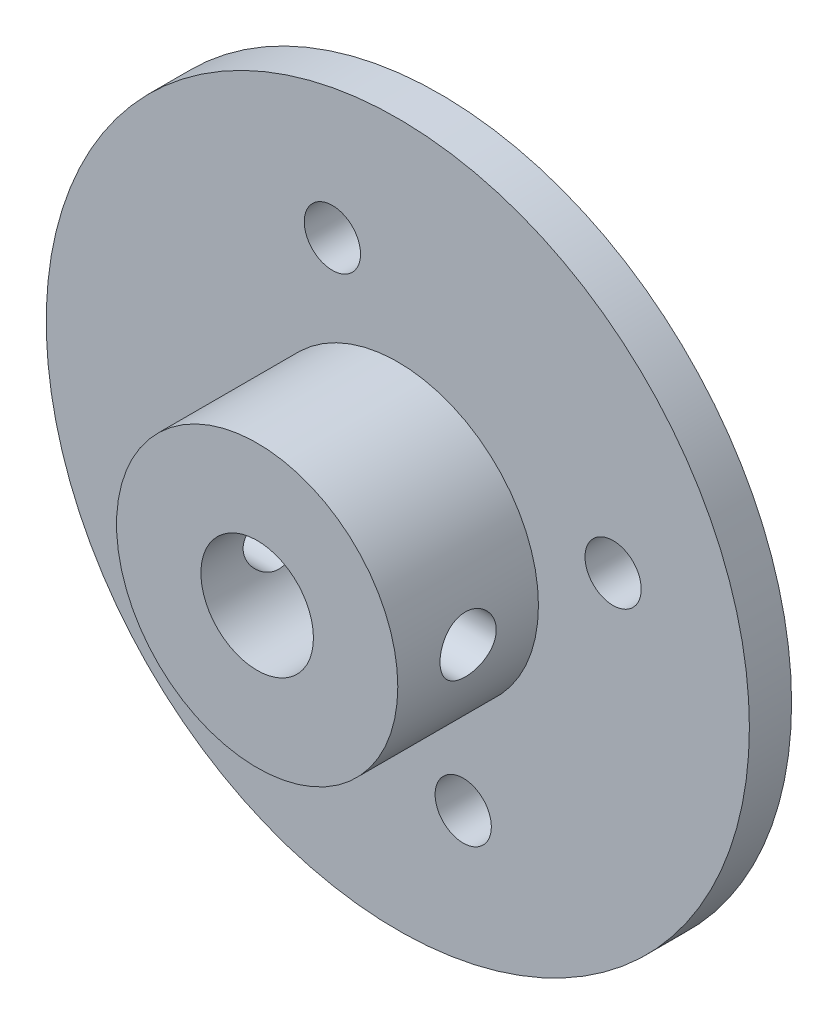
ISO-10303-21;
HEADER;
FILE_DESCRIPTION(('STEP AP214'),'2;1');
FILE_NAME('part.step','',(''),(''),'','','');
FILE_SCHEMA(('AUTOMOTIVE_DESIGN { 1 0 10303 214 1 1 1 1 }'));
ENDSEC;
DATA;
#1=APPLICATION_CONTEXT('core data for automotive mechanical design processes');
#2=APPLICATION_PROTOCOL_DEFINITION('international standard','automotive_design',2000,#1);
#3=PRODUCT_CONTEXT('',#1,'mechanical');
#4=PRODUCT('Part','Part','',(#3));
#5=PRODUCT_RELATED_PRODUCT_CATEGORY('part','',(#4));
#6=PRODUCT_DEFINITION_FORMATION('','',#4);
#7=PRODUCT_DEFINITION_CONTEXT('part definition',#1,'design');
#8=PRODUCT_DEFINITION('design','',#6,#7);
#9=PRODUCT_DEFINITION_SHAPE('','',#8);
#10=(LENGTH_UNIT() NAMED_UNIT(*) SI_UNIT(.MILLI.,.METRE.));
#11=(NAMED_UNIT(*) PLANE_ANGLE_UNIT() SI_UNIT($,.RADIAN.));
#12=(NAMED_UNIT(*) SI_UNIT($,.STERADIAN.) SOLID_ANGLE_UNIT());
#13=UNCERTAINTY_MEASURE_WITH_UNIT(LENGTH_MEASURE(1.E-05),#10,'distance_accuracy_value','');
#14=(GEOMETRIC_REPRESENTATION_CONTEXT(3) GLOBAL_UNCERTAINTY_ASSIGNED_CONTEXT((#13)) GLOBAL_UNIT_ASSIGNED_CONTEXT((#10,
#11,#12)) REPRESENTATION_CONTEXT('',''));
#15=CARTESIAN_POINT('',(0.,0.,0.));
#16=DIRECTION('',(0.,0.,1.));
#17=DIRECTION('',(1.,0.,0.));
#18=AXIS2_PLACEMENT_3D('',#15,#16,#17);
#19=CARTESIAN_POINT('',(0.,0.,3.));
#20=DIRECTION('',(0.,0.,-1.));
#21=DIRECTION('',(-1.,0.,0.));
#22=AXIS2_PLACEMENT_3D('',#19,#20,#21);
#23=CYLINDRICAL_SURFACE('',#22,25.);
#24=CARTESIAN_POINT('',(0.,0.,3.));
#25=DIRECTION('',(0.,0.,1.));
#26=DIRECTION('',(1.,0.,0.));
#27=AXIS2_PLACEMENT_3D('',#24,#25,#26);
#28=CIRCLE('',#27,25.);
#29=CARTESIAN_POINT('',(25.,0.,3.));
#30=VERTEX_POINT('',#29);
#31=EDGE_CURVE('E48',#30,#30,#28,.T.);
#32=ORIENTED_EDGE('',*,*,#31,.F.);
#33=EDGE_LOOP('',(#32));
#34=FACE_BOUND('',#33,.T.);
#35=CARTESIAN_POINT('',(0.,0.,0.));
#36=DIRECTION('',(0.,0.,1.));
#37=DIRECTION('',(1.,0.,0.));
#38=AXIS2_PLACEMENT_3D('',#35,#36,#37);
#39=CIRCLE('',#38,25.);
#40=CARTESIAN_POINT('',(25.,0.,0.));
#41=VERTEX_POINT('',#40);
#42=EDGE_CURVE('E53',#41,#41,#39,.T.);
#43=ORIENTED_EDGE('',*,*,#42,.T.);
#44=EDGE_LOOP('',(#43));
#45=FACE_BOUND('',#44,.T.);
#46=ADVANCED_FACE('F36',(#34,#45),#23,.T.);
#47=CARTESIAN_POINT('',(0.,0.,3.));
#48=DIRECTION('',(0.,0.,1.));
#49=DIRECTION('',(1.,0.,0.));
#50=AXIS2_PLACEMENT_3D('',#47,#48,#49);
#51=PLANE('',#50);
#52=CARTESIAN_POINT('',(-4.65167860969372,15.3088825886189,3.));
#53=DIRECTION('',(0.,0.,1.));
#54=DIRECTION('',(1.,0.,0.));
#55=AXIS2_PLACEMENT_3D('',#52,#53,#54);
#56=CIRCLE('',#55,2.);
#57=CARTESIAN_POINT('',(-2.65167860969372,15.3088825886189,3.));
#58=VERTEX_POINT('',#57);
#59=EDGE_CURVE('E261',#58,#58,#56,.T.);
#60=ORIENTED_EDGE('',*,*,#59,.F.);
#61=EDGE_LOOP('',(#60));
#62=FACE_BOUND('',#61,.T.);
#63=CARTESIAN_POINT('',(15.3088825886189,4.65167860969372,3.));
#64=DIRECTION('',(0.,0.,1.));
#65=DIRECTION('',(1.,0.,0.));
#66=AXIS2_PLACEMENT_3D('',#63,#64,#65);
#67=CIRCLE('',#66,2.);
#68=CARTESIAN_POINT('',(17.3088825886189,4.65167860969372,3.));
#69=VERTEX_POINT('',#68);
#70=EDGE_CURVE('E258',#69,#69,#67,.T.);
#71=ORIENTED_EDGE('',*,*,#70,.F.);
#72=EDGE_LOOP('',(#71));
#73=FACE_BOUND('',#72,.T.);
#74=CARTESIAN_POINT('',(4.65167860969373,-15.3088825886189,3.));
#75=DIRECTION('',(0.,0.,1.));
#76=DIRECTION('',(1.,0.,0.));
#77=AXIS2_PLACEMENT_3D('',#74,#75,#76);
#78=CIRCLE('',#77,2.);
#79=CARTESIAN_POINT('',(6.65167860969373,-15.3088825886189,3.));
#80=VERTEX_POINT('',#79);
#81=EDGE_CURVE('E252',#80,#80,#78,.T.);
#82=ORIENTED_EDGE('',*,*,#81,.F.);
#83=EDGE_LOOP('',(#82));
#84=FACE_BOUND('',#83,.T.);
#85=CARTESIAN_POINT('',(-15.3088825886189,-4.65167860969372,3.));
#86=DIRECTION('',(0.,0.,1.));
#87=DIRECTION('',(1.,0.,0.));
#88=AXIS2_PLACEMENT_3D('',#85,#86,#87);
#89=CIRCLE('',#88,2.);
#90=CARTESIAN_POINT('',(-13.3088825886189,-4.65167860969372,3.));
#91=VERTEX_POINT('',#90);
#92=EDGE_CURVE('E246',#91,#91,#89,.T.);
#93=ORIENTED_EDGE('',*,*,#92,.F.);
#94=EDGE_LOOP('',(#93));
#95=FACE_BOUND('',#94,.T.);
#96=CARTESIAN_POINT('',(0.,0.,3.));
#97=DIRECTION('',(0.,0.,1.));
#98=DIRECTION('',(1.,0.,0.));
#99=AXIS2_PLACEMENT_3D('',#96,#97,#98);
#100=CIRCLE('',#99,10.);
#101=CARTESIAN_POINT('',(10.,0.,3.));
#102=VERTEX_POINT('',#101);
#103=EDGE_CURVE('E10',#102,#102,#100,.T.);
#104=ORIENTED_EDGE('',*,*,#103,.F.);
#105=EDGE_LOOP('',(#104));
#106=FACE_BOUND('',#105,.T.);
#107=ORIENTED_EDGE('',*,*,#31,.T.);
#108=EDGE_LOOP('',(#107));
#109=FACE_BOUND('',#108,.T.);
#110=ADVANCED_FACE('F100',(#62,#73,#84,#95,#106,#109),#51,.T.);
#111=CARTESIAN_POINT('',(0.,0.,0.));
#112=DIRECTION('',(0.,0.,1.));
#113=DIRECTION('',(1.,0.,0.));
#114=AXIS2_PLACEMENT_3D('',#111,#112,#113);
#115=PLANE('',#114);
#116=CARTESIAN_POINT('',(-4.65167860969372,15.3088825886189,0.));
#117=DIRECTION('',(0.,0.,1.));
#118=DIRECTION('',(1.,0.,0.));
#119=AXIS2_PLACEMENT_3D('',#116,#117,#118);
#120=CIRCLE('',#119,2.);
#121=CARTESIAN_POINT('',(-2.65167860969372,15.3088825886189,0.));
#122=VERTEX_POINT('',#121);
#123=EDGE_CURVE('E241',#122,#122,#120,.T.);
#124=ORIENTED_EDGE('',*,*,#123,.T.);
#125=EDGE_LOOP('',(#124));
#126=FACE_BOUND('',#125,.T.);
#127=CARTESIAN_POINT('',(15.3088825886189,4.65167860969372,0.));
#128=DIRECTION('',(0.,0.,1.));
#129=DIRECTION('',(1.,0.,0.));
#130=AXIS2_PLACEMENT_3D('',#127,#128,#129);
#131=CIRCLE('',#130,2.);
#132=CARTESIAN_POINT('',(17.3088825886189,4.65167860969372,0.));
#133=VERTEX_POINT('',#132);
#134=EDGE_CURVE('E255',#133,#133,#131,.T.);
#135=ORIENTED_EDGE('',*,*,#134,.T.);
#136=EDGE_LOOP('',(#135));
#137=FACE_BOUND('',#136,.T.);
#138=CARTESIAN_POINT('',(4.65167860969373,-15.3088825886189,0.));
#139=DIRECTION('',(0.,0.,1.));
#140=DIRECTION('',(1.,0.,0.));
#141=AXIS2_PLACEMENT_3D('',#138,#139,#140);
#142=CIRCLE('',#141,2.);
#143=CARTESIAN_POINT('',(6.65167860969373,-15.3088825886189,0.));
#144=VERTEX_POINT('',#143);
#145=EDGE_CURVE('E249',#144,#144,#142,.T.);
#146=ORIENTED_EDGE('',*,*,#145,.T.);
#147=EDGE_LOOP('',(#146));
#148=FACE_BOUND('',#147,.T.);
#149=CARTESIAN_POINT('',(-15.3088825886189,-4.65167860969372,0.));
#150=DIRECTION('',(0.,0.,1.));
#151=DIRECTION('',(1.,0.,0.));
#152=AXIS2_PLACEMENT_3D('',#149,#150,#151);
#153=CIRCLE('',#152,2.);
#154=CARTESIAN_POINT('',(-13.3088825886189,-4.65167860969372,0.));
#155=VERTEX_POINT('',#154);
#156=EDGE_CURVE('E243',#155,#155,#153,.T.);
#157=ORIENTED_EDGE('',*,*,#156,.T.);
#158=EDGE_LOOP('',(#157));
#159=FACE_BOUND('',#158,.T.);
#160=CARTESIAN_POINT('',(0.,0.,0.));
#161=DIRECTION('',(0.,0.,1.));
#162=DIRECTION('',(1.,0.,0.));
#163=AXIS2_PLACEMENT_3D('',#160,#161,#162);
#164=CIRCLE('',#163,4.);
#165=CARTESIAN_POINT('',(4.,0.,0.));
#166=VERTEX_POINT('',#165);
#167=EDGE_CURVE('E236',#166,#166,#164,.T.);
#168=ORIENTED_EDGE('',*,*,#167,.T.);
#169=EDGE_LOOP('',(#168));
#170=FACE_BOUND('',#169,.T.);
#171=ORIENTED_EDGE('',*,*,#42,.F.);
#172=EDGE_LOOP('',(#171));
#173=FACE_BOUND('',#172,.T.);
#174=ADVANCED_FACE('F98',(#126,#137,#148,#159,#170,#173),#115,.F.);
#175=CARTESIAN_POINT('',(0.,0.,13.));
#176=DIRECTION('',(0.,0.,-1.));
#177=DIRECTION('',(-1.,0.,0.));
#178=AXIS2_PLACEMENT_3D('',#175,#176,#177);
#179=CYLINDRICAL_SURFACE('',#178,10.);
#180=CARTESIAN_POINT('',(-10.,0.,10.));
#181=CARTESIAN_POINT('',(-9.99999795161742,-0.111153813585266,9.99999591100331));
#182=CARTESIAN_POINT('',(-9.99812770356462,-0.222359320403045,9.99070231406471));
#183=CARTESIAN_POINT('',(-9.99084731246463,-0.441627015378039,9.95380299976951));
#184=CARTESIAN_POINT('',(-9.98543435720372,-0.549686635082712,9.92618273439698));
#185=CARTESIAN_POINT('',(-9.97167298556573,-0.759460610526626,9.85351745275842));
#186=CARTESIAN_POINT('',(-9.96332738153436,-0.861180935866268,9.80848912631062));
#187=CARTESIAN_POINT('',(-9.94460796070629,-1.05561597772845,9.70233550497741));
#188=CARTESIAN_POINT('',(-9.93423426471414,-1.14833123015162,9.64121116878559));
#189=CARTESIAN_POINT('',(-9.9124433065994,-1.32338695462973,9.50372301141713));
#190=CARTESIAN_POINT('',(-9.90101491008695,-1.40558790231705,9.4271832892176));
#191=CARTESIAN_POINT('',(-9.87848360905177,-1.55607351321606,9.2614151672166));
#192=CARTESIAN_POINT('',(-9.86738073000848,-1.62435708954085,9.17218577732976));
#193=CARTESIAN_POINT('',(-9.8466488362523,-1.74566350669524,8.98256761397625));
#194=CARTESIAN_POINT('',(-9.83703414729892,-1.79854187773173,8.88208471240728));
#195=CARTESIAN_POINT('',(-9.82052536116836,-1.88661133316062,8.67343636199184));
#196=CARTESIAN_POINT('',(-9.81363099523923,-1.92180416487448,8.56527167330731));
#197=CARTESIAN_POINT('',(-9.80345610504409,-1.97305059976965,8.34583127218416));
#198=CARTESIAN_POINT('',(-9.80012940214375,-1.98934899591755,8.23461491171555));
#199=CARTESIAN_POINT('',(-9.79732750121254,-2.00310425545224,8.01098035727131));
#200=CARTESIAN_POINT('',(-9.79785190935681,-2.000563045427,7.89856228735971));
#201=CARTESIAN_POINT('',(-9.80265102296369,-1.97690914620364,7.67750642395799));
#202=CARTESIAN_POINT('',(-9.80686905717527,-1.95607708048781,7.56883718874537));
#203=CARTESIAN_POINT('',(-9.81849092320002,-1.8968757692461,7.356567846674));
#204=CARTESIAN_POINT('',(-9.82589490715558,-1.85850568620136,7.25296798216198));
#205=CARTESIAN_POINT('',(-9.84311237000816,-1.76504956734944,7.0529694765928));
#206=CARTESIAN_POINT('',(-9.85294179627409,-1.70985230246423,6.95662424086166));
#207=CARTESIAN_POINT('',(-9.87389237546124,-1.58438714914536,6.77445830005437));
#208=CARTESIAN_POINT('',(-9.88501367676732,-1.51411752871366,6.68863880629769));
#209=CARTESIAN_POINT('',(-9.90754042482924,-1.35899986912117,6.52834119508613));
#210=CARTESIAN_POINT('',(-9.9189473842181,-1.27391232242489,6.45409486428174));
#211=CARTESIAN_POINT('',(-9.94057697428817,-1.09237004812402,6.32089230739755));
#212=CARTESIAN_POINT('',(-9.95079958977947,-0.995915174758778,6.26193627741284));
#213=CARTESIAN_POINT('',(-9.96893380321774,-0.794118773757842,6.16094498154805));
#214=CARTESIAN_POINT('',(-9.97684177696544,-0.688763639170601,6.11893621271093));
#215=CARTESIAN_POINT('',(-9.98942817975716,-0.47229795289733,6.05327905192287));
#216=CARTESIAN_POINT('',(-9.99410700001063,-0.3611881001449,6.02962843585274));
#217=CARTESIAN_POINT('',(-9.99965343733735,-0.138358811254301,6.00168709241145));
#218=CARTESIAN_POINT('',(-10.0005834930494,-0.0266806566511528,5.99707916091946));
#219=CARTESIAN_POINT('',(-9.99870103860205,0.195849868385428,6.00649971788436));
#220=CARTESIAN_POINT('',(-9.99588873882892,0.306702284887586,6.02052715870519));
#221=CARTESIAN_POINT('',(-9.98687664016035,0.523411319893081,6.06655674708791));
#222=CARTESIAN_POINT('',(-9.98070752808413,0.629303896679806,6.09839613699581));
#223=CARTESIAN_POINT('',(-9.96567104122065,0.834247254999334,6.17896796531162));
#224=CARTESIAN_POINT('',(-9.95680346428454,0.933297523275079,6.22770166935366));
#225=CARTESIAN_POINT('',(-9.93719823066589,1.12308234737243,6.34136498130263));
#226=CARTESIAN_POINT('',(-9.92643900874104,1.21370025350438,6.40648556207789));
#227=CARTESIAN_POINT('',(-9.90429469659765,1.38283603823841,6.55081838241456));
#228=CARTESIAN_POINT('',(-9.89290953936776,1.46135261786152,6.63003213279973));
#229=CARTESIAN_POINT('',(-9.8705860711393,1.60528118154835,6.80174670378225));
#230=CARTESIAN_POINT('',(-9.85965720466609,1.67047540489731,6.89443148844267));
#231=CARTESIAN_POINT('',(-9.83968383592389,1.78437084010241,7.08962272271336));
#232=CARTESIAN_POINT('',(-9.83063925826685,1.83307271184581,7.19212877914711));
#233=CARTESIAN_POINT('',(-9.81553481168766,1.91230368316392,7.4035364922991));
#234=CARTESIAN_POINT('',(-9.80945949744373,1.9429269995821,7.51240168242064));
#235=CARTESIAN_POINT('',(-9.8009487358405,1.98541730325439,7.73386690698181));
#236=CARTESIAN_POINT('',(-9.79851281382223,1.99728673645023,7.84646645241869));
#237=CARTESIAN_POINT('',(-9.79758299262758,2.00184182173494,8.07001772908864));
#238=CARTESIAN_POINT('',(-9.79901838378602,1.99487157614179,8.18096229785402));
#239=CARTESIAN_POINT('',(-9.80551146969228,1.96270460820012,8.40006329981005));
#240=CARTESIAN_POINT('',(-9.81056913534338,1.9375080322586,8.50821975538961));
#241=CARTESIAN_POINT('',(-9.82370528438317,1.86975713699791,8.71845542248109));
#242=CARTESIAN_POINT('',(-9.83177642037661,1.82724501343469,8.82054872100483));
#243=CARTESIAN_POINT('',(-9.85003429948341,1.72610928920321,9.01620744146888));
#244=CARTESIAN_POINT('',(-9.86022121997788,1.66748433754977,9.10977214745027));
#245=CARTESIAN_POINT('',(-9.88177921046451,1.53461182957283,9.28743114430063));
#246=CARTESIAN_POINT('',(-9.89316745819399,1.46011577447036,9.37133753053519));
#247=CARTESIAN_POINT('',(-9.91572163743909,1.29812873802628,9.52557241105834));
#248=CARTESIAN_POINT('',(-9.92688751726369,1.21063477430667,9.59589778063454));
#249=CARTESIAN_POINT('',(-9.94787664775943,1.02403525817649,9.72166928789289));
#250=CARTESIAN_POINT('',(-9.95768462438492,0.92481776885967,9.77695200656005));
#251=CARTESIAN_POINT('',(-9.9747025017,0.718332721881466,9.86997224519318));
#252=CARTESIAN_POINT('',(-9.98191474277232,0.611072521726253,9.90772557906498));
#253=CARTESIAN_POINT('',(-9.99152745190741,0.419642977847559,9.95730389608943));
#254=CARTESIAN_POINT('',(-9.99468606316904,0.336563328027569,9.97328638741552));
#255=CARTESIAN_POINT('',(-9.99892308279786,0.168999050420134,9.99463582471673));
#256=CARTESIAN_POINT('',(-10.0000015574631,0.0845144674972381,10.0000031090195));
#257=CARTESIAN_POINT('',(-10.,0.,10.));
#258=B_SPLINE_CURVE_WITH_KNOTS('',3,(#180,#181,#182,#183,#184,#185,#186,#187,#188,#189,#190,
#191,#192,#193,#194,#195,#196,#197,#198,#199,#200,#201,#202,#203,#204,#205,#206,#207,#208,#209,
#210,#211,#212,#213,#214,#215,#216,#217,#218,#219,#220,#221,#222,#223,#224,#225,#226,#227,#228,
#229,#230,#231,#232,#233,#234,#235,#236,#237,#238,#239,#240,#241,#242,#243,#244,#245,#246,#247,
#248,#249,#250,#251,#252,#253,#254,#255,#256,#257),.UNSPECIFIED.,.T.,.F.,(4,2,2,2,2,2,2,2,2,2,2,
2,2,2,2,2,2,2,2,2,2,2,2,2,2,2,2,2,2,2,2,2,2,2,2,2,2,2,4),(0.,0.333152261322517,
0.666569301382646,0.999667470500683,1.33274580446173,1.66986534022437,2.00701119349473,
2.34722390011845,2.68740298730395,3.02312370207175,3.3588100856245,3.68943454012557,
4.02007478507459,4.35294980407185,4.68586309499341,5.02476504982701,5.36367135079641,
5.70310549708048,6.04249851396072,6.3762147135253,6.70991215315735,7.04060907901447,
7.37133078432045,7.70610132066717,8.0409077669186,8.38081257158452,8.72070377446933,
9.05880762065446,9.3968673666083,9.72879445135403,10.0607188698522,10.3918392250622,
10.7229873516373,11.0597615247829,11.3966130906586,11.7369899335127,12.0770591103504,
12.3303755057979,12.5836838274199),.UNSPECIFIED.);
#259=CARTESIAN_POINT('',(-10.,0.,10.));
#260=VERTEX_POINT('',#259);
#261=EDGE_CURVE('E88',#260,#260,#258,.T.);
#262=ORIENTED_EDGE('',*,*,#261,.T.);
#263=EDGE_LOOP('',(#262));
#264=FACE_BOUND('',#263,.T.);
#265=CARTESIAN_POINT('',(10.,0.,6.));
#266=CARTESIAN_POINT('',(9.99999795161742,-0.111153813585266,6.00000408899669));
#267=CARTESIAN_POINT('',(9.99812770356462,-0.222359320403045,6.00929768593529));
#268=CARTESIAN_POINT('',(9.99084731246463,-0.441627015378039,6.04619700023049));
#269=CARTESIAN_POINT('',(9.98543435720372,-0.549686635082712,6.07381726560302));
#270=CARTESIAN_POINT('',(9.97167298556573,-0.759460610526626,6.14648254724158));
#271=CARTESIAN_POINT('',(9.96332738153436,-0.861180935866269,6.19151087368938));
#272=CARTESIAN_POINT('',(9.94460796070629,-1.05561597772845,6.29766449502259));
#273=CARTESIAN_POINT('',(9.93423426471414,-1.14833123015162,6.35878883121441));
#274=CARTESIAN_POINT('',(9.9124433065994,-1.32338695462973,6.49627698858287));
#275=CARTESIAN_POINT('',(9.90101491008695,-1.40558790231705,6.5728167107824));
#276=CARTESIAN_POINT('',(9.87848360905177,-1.55607351321606,6.73858483278341));
#277=CARTESIAN_POINT('',(9.86738073000847,-1.62435708954085,6.82781422267024));
#278=CARTESIAN_POINT('',(9.8466488362523,-1.74566350669524,7.01743238602375));
#279=CARTESIAN_POINT('',(9.83703414729892,-1.79854187773173,7.11791528759272));
#280=CARTESIAN_POINT('',(9.82052536116836,-1.88661133316062,7.32656363800816));
#281=CARTESIAN_POINT('',(9.81363099523923,-1.92180416487448,7.43472832669269));
#282=CARTESIAN_POINT('',(9.80345610504409,-1.97305059976966,7.65416872781584));
#283=CARTESIAN_POINT('',(9.80012940214375,-1.98934899591755,7.76538508828445));
#284=CARTESIAN_POINT('',(9.79732750121254,-2.00310425545224,7.98901964272869));
#285=CARTESIAN_POINT('',(9.79785190935681,-2.000563045427,8.10143771264029));
#286=CARTESIAN_POINT('',(9.80265102296369,-1.97690914620364,8.32249357604201));
#287=CARTESIAN_POINT('',(9.80686905717527,-1.95607708048781,8.43116281125463));
#288=CARTESIAN_POINT('',(9.81849092320002,-1.8968757692461,8.64343215332601));
#289=CARTESIAN_POINT('',(9.82589490715558,-1.85850568620136,8.74703201783802));
#290=CARTESIAN_POINT('',(9.84311237000816,-1.76504956734944,8.9470305234072));
#291=CARTESIAN_POINT('',(9.85294179627409,-1.70985230246423,9.04337575913834));
#292=CARTESIAN_POINT('',(9.87389237546124,-1.58438714914536,9.22554169994563));
#293=CARTESIAN_POINT('',(9.88501367676732,-1.51411752871366,9.31136119370231));
#294=CARTESIAN_POINT('',(9.90754042482924,-1.35899986912117,9.47165880491387));
#295=CARTESIAN_POINT('',(9.9189473842181,-1.27391232242489,9.54590513571826));
#296=CARTESIAN_POINT('',(9.94057697428817,-1.09237004812402,9.67910769260245));
#297=CARTESIAN_POINT('',(9.95079958977947,-0.995915174758778,9.73806372258716));
#298=CARTESIAN_POINT('',(9.96893380321774,-0.794118773757841,9.83905501845195));
#299=CARTESIAN_POINT('',(9.97684177696544,-0.6887636391706,9.88106378728907));
#300=CARTESIAN_POINT('',(9.98942817975716,-0.472297952897329,9.94672094807713));
#301=CARTESIAN_POINT('',(9.99410700001063,-0.361188100144898,9.97037156414726));
#302=CARTESIAN_POINT('',(9.99965343733736,-0.1383588112543,9.99831290758856));
#303=CARTESIAN_POINT('',(10.0005834930494,-0.0266806566511518,10.0029208390805));
#304=CARTESIAN_POINT('',(9.99870103860205,0.195849868385429,9.99350028211564));
#305=CARTESIAN_POINT('',(9.99588873882892,0.306702284887587,9.97947284129481));
#306=CARTESIAN_POINT('',(9.98687664016035,0.523411319893082,9.93344325291209));
#307=CARTESIAN_POINT('',(9.98070752808413,0.629303896679806,9.90160386300419));
#308=CARTESIAN_POINT('',(9.96567104122065,0.834247254999335,9.82103203468838));
#309=CARTESIAN_POINT('',(9.95680346428453,0.933297523275079,9.77229833064634));
#310=CARTESIAN_POINT('',(9.93719823066589,1.12308234737244,9.65863501869738));
#311=CARTESIAN_POINT('',(9.92643900874103,1.21370025350438,9.59351443792211));
#312=CARTESIAN_POINT('',(9.90429469659765,1.38283603823841,9.44918161758544));
#313=CARTESIAN_POINT('',(9.89290953936776,1.46135261786153,9.36996786720027));
#314=CARTESIAN_POINT('',(9.8705860711393,1.60528118154835,9.19825329621775));
#315=CARTESIAN_POINT('',(9.85965720466609,1.67047540489731,9.10556851155732));
#316=CARTESIAN_POINT('',(9.83968383592389,1.78437084010241,8.91037727728664));
#317=CARTESIAN_POINT('',(9.83063925826685,1.83307271184581,8.8078712208529));
#318=CARTESIAN_POINT('',(9.81553481168766,1.91230368316392,8.5964635077009));
#319=CARTESIAN_POINT('',(9.80945949744373,1.9429269995821,8.48759831757936));
#320=CARTESIAN_POINT('',(9.8009487358405,1.98541730325439,8.26613309301819));
#321=CARTESIAN_POINT('',(9.79851281382223,1.99728673645023,8.1535335475813));
#322=CARTESIAN_POINT('',(9.79758299262758,2.00184182173494,7.92998227091136));
#323=CARTESIAN_POINT('',(9.79901838378602,1.99487157614179,7.81903770214598));
#324=CARTESIAN_POINT('',(9.80551146969228,1.96270460820012,7.59993670018995));
#325=CARTESIAN_POINT('',(9.81056913534338,1.9375080322586,7.49178024461039));
#326=CARTESIAN_POINT('',(9.82370528438317,1.86975713699791,7.28154457751891));
#327=CARTESIAN_POINT('',(9.83177642037661,1.82724501343469,7.17945127899517));
#328=CARTESIAN_POINT('',(9.85003429948341,1.72610928920321,6.98379255853112));
#329=CARTESIAN_POINT('',(9.86022121997788,1.66748433754976,6.89022785254972));
#330=CARTESIAN_POINT('',(9.88177921046451,1.53461182957283,6.71256885569937));
#331=CARTESIAN_POINT('',(9.89316745819399,1.46011577447036,6.62866246946481));
#332=CARTESIAN_POINT('',(9.91572163743909,1.29812873802628,6.47442758894166));
#333=CARTESIAN_POINT('',(9.92688751726369,1.21063477430667,6.40410221936546));
#334=CARTESIAN_POINT('',(9.94787664775943,1.02403525817649,6.27833071210711));
#335=CARTESIAN_POINT('',(9.95768462438492,0.924817768859669,6.22304799343995));
#336=CARTESIAN_POINT('',(9.9747025017,0.718332721881465,6.13002775480682));
#337=CARTESIAN_POINT('',(9.98191474277232,0.611072521726252,6.09227442093502));
#338=CARTESIAN_POINT('',(9.99152745190741,0.419642977847558,6.04269610391057));
#339=CARTESIAN_POINT('',(9.99468606316904,0.336563328027569,6.02671361258448));
#340=CARTESIAN_POINT('',(9.99892308279786,0.168999050420134,6.00536417528327));
#341=CARTESIAN_POINT('',(10.0000015574631,0.084514467497238,5.99999689098046));
#342=CARTESIAN_POINT('',(10.,0.,6.));
#343=B_SPLINE_CURVE_WITH_KNOTS('',3,(#265,#266,#267,#268,#269,#270,#271,#272,#273,#274,#275,
#276,#277,#278,#279,#280,#281,#282,#283,#284,#285,#286,#287,#288,#289,#290,#291,#292,#293,#294,
#295,#296,#297,#298,#299,#300,#301,#302,#303,#304,#305,#306,#307,#308,#309,#310,#311,#312,#313,
#314,#315,#316,#317,#318,#319,#320,#321,#322,#323,#324,#325,#326,#327,#328,#329,#330,#331,#332,
#333,#334,#335,#336,#337,#338,#339,#340,#341,#342),.UNSPECIFIED.,.T.,.F.,(4,2,2,2,2,2,2,2,2,2,2,
2,2,2,2,2,2,2,2,2,2,2,2,2,2,2,2,2,2,2,2,2,2,2,2,2,2,2,4),(0.,0.333152261322517,
0.666569301382646,0.999667470500684,1.33274580446173,1.66986534022437,2.00701119349473,
2.34722390011846,2.68740298730395,3.02312370207175,3.3588100856245,3.68943454012557,
4.02007478507459,4.35294980407185,4.68586309499341,5.02476504982701,5.36367135079641,
5.70310549708048,6.04249851396072,6.3762147135253,6.70991215315735,7.04060907901447,
7.37133078432045,7.70610132066717,8.0409077669186,8.38081257158452,8.72070377446933,
9.05880762065446,9.3968673666083,9.72879445135403,10.0607188698522,10.3918392250622,
10.7229873516373,11.0597615247829,11.3966130906586,11.7369899335127,12.0770591103504,
12.3303755057979,12.5836838274199),.UNSPECIFIED.);
#344=CARTESIAN_POINT('',(10.,0.,6.));
#345=VERTEX_POINT('',#344);
#346=EDGE_CURVE('E82',#345,#345,#343,.T.);
#347=ORIENTED_EDGE('',*,*,#346,.T.);
#348=EDGE_LOOP('',(#347));
#349=FACE_BOUND('',#348,.T.);
#350=CARTESIAN_POINT('',(0.,0.,13.));
#351=DIRECTION('',(0.,0.,1.));
#352=DIRECTION('',(1.,0.,0.));
#353=AXIS2_PLACEMENT_3D('',#350,#351,#352);
#354=CIRCLE('',#353,10.);
#355=CARTESIAN_POINT('',(10.,0.,13.));
#356=VERTEX_POINT('',#355);
#357=EDGE_CURVE('E56',#356,#356,#354,.T.);
#358=ORIENTED_EDGE('',*,*,#357,.F.);
#359=EDGE_LOOP('',(#358));
#360=FACE_BOUND('',#359,.T.);
#361=ORIENTED_EDGE('',*,*,#103,.T.);
#362=EDGE_LOOP('',(#361));
#363=FACE_BOUND('',#362,.T.);
#364=ADVANCED_FACE('F93',(#264,#349,#360,#363),#179,.T.);
#365=CARTESIAN_POINT('',(0.,0.,13.));
#366=DIRECTION('',(0.,0.,1.));
#367=DIRECTION('',(1.,0.,0.));
#368=AXIS2_PLACEMENT_3D('',#365,#366,#367);
#369=PLANE('',#368);
#370=CARTESIAN_POINT('',(0.,0.,13.));
#371=DIRECTION('',(0.,0.,1.));
#372=DIRECTION('',(1.,0.,0.));
#373=AXIS2_PLACEMENT_3D('',#370,#371,#372);
#374=CIRCLE('',#373,4.);
#375=CARTESIAN_POINT('',(4.,0.,13.));
#376=VERTEX_POINT('',#375);
#377=EDGE_CURVE('E232',#376,#376,#374,.T.);
#378=ORIENTED_EDGE('',*,*,#377,.F.);
#379=EDGE_LOOP('',(#378));
#380=FACE_BOUND('',#379,.T.);
#381=ORIENTED_EDGE('',*,*,#357,.T.);
#382=EDGE_LOOP('',(#381));
#383=FACE_BOUND('',#382,.T.);
#384=ADVANCED_FACE('F97',(#380,#383),#369,.T.);
#385=CARTESIAN_POINT('',(0.,0.,0.));
#386=DIRECTION('',(0.,0.,1.));
#387=DIRECTION('',(1.,0.,0.));
#388=AXIS2_PLACEMENT_3D('',#385,#386,#387);
#389=CYLINDRICAL_SURFACE('',#388,4.);
#390=CARTESIAN_POINT('',(4.,0.,6.));
#391=CARTESIAN_POINT('',(3.99999426810082,0.105143925902467,6.00000660463438));
#392=CARTESIAN_POINT('',(3.99580982039513,0.210413199395125,6.00834014624211));
#393=CARTESIAN_POINT('',(3.97948312074314,0.417840470537792,6.04130576068308));
#394=CARTESIAN_POINT('',(3.96732575657839,0.519992173427259,6.06596878599563));
#395=CARTESIAN_POINT('',(3.93632558806751,0.717867089760898,6.13038761723326));
#396=CARTESIAN_POINT('',(3.91750878355075,0.813613605878293,6.17008476849594));
#397=CARTESIAN_POINT('',(3.87491553031523,0.996945233613197,6.26314124272997));
#398=CARTESIAN_POINT('',(3.85113947267051,1.08453098798012,6.31649948849773));
#399=CARTESIAN_POINT('',(3.79912516516124,1.25501563552382,6.43903449897057));
#400=CARTESIAN_POINT('',(3.77070398255074,1.33731042224422,6.50897295847928));
#401=CARTESIAN_POINT('',(3.71319940493486,1.48955888973396,6.66104295849407));
#402=CARTESIAN_POINT('',(3.68411552418069,1.55950316621353,6.74318370354488));
#403=CARTESIAN_POINT('',(3.62597902394695,1.69050400090056,6.92496669904676));
#404=CARTESIAN_POINT('',(3.59710373940264,1.75045067110327,7.02547219669183));
#405=CARTESIAN_POINT('',(3.54571957544641,1.85233645378139,7.23673467197243));
#406=CARTESIAN_POINT('',(3.52320615213979,1.89428842993267,7.3474842574455));
#407=CARTESIAN_POINT('',(3.48915734075617,1.95626488437718,7.56933021084385));
#408=CARTESIAN_POINT('',(3.47704543167427,1.97745171416088,7.68000890413479));
#409=CARTESIAN_POINT('',(3.46363779897055,2.00085398661769,7.90395767555895));
#410=CARTESIAN_POINT('',(3.46233138686576,2.00308817674615,8.01722508174231));
#411=CARTESIAN_POINT('',(3.47021860514497,1.98937457434459,8.22857204863074));
#412=CARTESIAN_POINT('',(3.47817527324027,1.97556911907364,8.3268480624461));
#413=CARTESIAN_POINT('',(3.50152457467701,1.93387969811387,8.51944381874609));
#414=CARTESIAN_POINT('',(3.51691957663553,1.9059912477953,8.61376229061063));
#415=CARTESIAN_POINT('',(3.55374952825482,1.83641956077201,8.79845826513132));
#416=CARTESIAN_POINT('',(3.57531681327997,1.79443013423199,8.88869279757158));
#417=CARTESIAN_POINT('',(3.62206808562807,1.698083375336,9.06126858518002));
#418=CARTESIAN_POINT('',(3.64725369560381,1.64372048762493,9.14360627120018));
#419=CARTESIAN_POINT('',(3.70226315806572,1.51613210982558,9.30904250548645));
#420=CARTESIAN_POINT('',(3.73227020473492,1.44138891673856,9.39091374715232));
#421=CARTESIAN_POINT('',(3.79095246600814,1.27911115748275,9.54147083718181));
#422=CARTESIAN_POINT('',(3.81962703917602,1.19157051314857,9.61015038406777));
#423=CARTESIAN_POINT('',(3.87403974565928,1.0010330116637,9.73537132205946));
#424=CARTESIAN_POINT('',(3.89957968324014,0.897507183198818,9.79120094489148));
#425=CARTESIAN_POINT('',(3.94315762242485,0.680932430977593,9.88419405808602));
#426=CARTESIAN_POINT('',(3.96120157887106,0.567891152530551,9.92137237003033));
#427=CARTESIAN_POINT('',(3.98648667482871,0.345532983321404,9.97295080743335));
#428=CARTESIAN_POINT('',(3.9944987660262,0.236683061096652,9.98898247149356));
#429=CARTESIAN_POINT('',(4.00146026918207,0.0175591998987035,10.002929462269));
#430=CARTESIAN_POINT('',(4.00041397442637,-0.0927140397398172,10.0008533712789));
#431=CARTESIAN_POINT('',(3.9898238450687,-0.302465943971974,9.97958662316251));
#432=CARTESIAN_POINT('',(3.98094491376337,-0.40211881609986,9.96173493454001));
#433=CARTESIAN_POINT('',(3.9564434262968,-0.596813784603882,9.91152385620976));
#434=CARTESIAN_POINT('',(3.94082012668824,-0.691855371382173,9.87916286709301));
#435=CARTESIAN_POINT('',(3.90368502827176,-0.877777216899145,9.80000306713393));
#436=CARTESIAN_POINT('',(3.88201763539261,-0.968460794011607,9.75281789976743));
#437=CARTESIAN_POINT('',(3.83487948634835,-1.14092272339854,9.64578492870687));
#438=CARTESIAN_POINT('',(3.80940711133877,-1.22269725955318,9.58593173080921));
#439=CARTESIAN_POINT('',(3.75416442672396,-1.38353537857843,9.44847914933857));
#440=CARTESIAN_POINT('',(3.72421769686998,-1.46154415563805,9.36971426310971));
#441=CARTESIAN_POINT('',(3.6652478321764,-1.60371264223771,9.20014969744455));
#442=CARTESIAN_POINT('',(3.63622534800094,-1.66786277142375,9.10934176230416));
#443=CARTESIAN_POINT('',(3.58102384412979,-1.78341582895804,8.91271269165405));
#444=CARTESIAN_POINT('',(3.55505059178121,-1.8340509916005,8.80637746781104));
#445=CARTESIAN_POINT('',(3.51148144588269,-1.91616565186941,8.58497986485007));
#446=CARTESIAN_POINT('',(3.493874764435,-1.94766983173403,8.46992894706622));
#447=CARTESIAN_POINT('',(3.47123002051604,-1.98772337493374,8.24617955423059));
#448=CARTESIAN_POINT('',(3.4651476693013,-1.9981859928109,8.13793149312952));
#449=CARTESIAN_POINT('',(3.46330709283206,-2.0013783087524,7.92110586567095));
#450=CARTESIAN_POINT('',(3.4675443925278,-1.99411569324648,7.81252846252428));
#451=CARTESIAN_POINT('',(3.48475724102153,-1.96385225118662,7.60903299693313));
#452=CARTESIAN_POINT('',(3.49686188965317,-1.94241662868607,7.51379905971052));
#453=CARTESIAN_POINT('',(3.52742032375305,-1.88635071644882,7.32838376115127));
#454=CARTESIAN_POINT('',(3.54587615139337,-1.85171618231984,7.23820403581594));
#455=CARTESIAN_POINT('',(3.58857060729071,-1.76763149060113,7.05875029802693));
#456=CARTESIAN_POINT('',(3.61311444791841,-1.7173422756314,6.96994419634195));
#457=CARTESIAN_POINT('',(3.66470663269721,-1.60430194327479,6.80145092763749));
#458=CARTESIAN_POINT('',(3.69175627591221,-1.54154434248312,6.72176853895778));
#459=CARTESIAN_POINT('',(3.74924646316184,-1.39640665332275,6.56371603529065));
#460=CARTESIAN_POINT('',(3.77969966613256,-1.31256884599452,6.48668179529942));
#461=CARTESIAN_POINT('',(3.83755504519861,-1.1323096124664,6.34747403312946));
#462=CARTESIAN_POINT('',(3.8649555725239,-1.0358814466104,6.28530852106019));
#463=CARTESIAN_POINT('',(3.91396019133075,-0.831863193565892,6.17752727457586));
#464=CARTESIAN_POINT('',(3.93552192987866,-0.724199007553461,6.13203166152707));
#465=CARTESIAN_POINT('',(3.97002682597974,-0.501484202276173,6.06038366448518));
#466=CARTESIAN_POINT('',(3.98299446726136,-0.3864555991782,6.03417630638857));
#467=CARTESIAN_POINT('',(3.99390923826956,-0.225203892981791,6.01220517782852));
#468=CARTESIAN_POINT('',(3.99618730680502,-0.18032375888313,6.00763471826732));
#469=CARTESIAN_POINT('',(3.99923393953631,-0.0903034636101834,6.00153066897183));
#470=CARTESIAN_POINT('',(4.00000246206762,-0.045163295293257,5.99999716305958));
#471=CARTESIAN_POINT('',(4.,0.,6.));
#472=B_SPLINE_CURVE_WITH_KNOTS('',3,(#390,#391,#392,#393,#394,#395,#396,#397,#398,#399,#400,
#401,#402,#403,#404,#405,#406,#407,#408,#409,#410,#411,#412,#413,#414,#415,#416,#417,#418,#419,
#420,#421,#422,#423,#424,#425,#426,#427,#428,#429,#430,#431,#432,#433,#434,#435,#436,#437,#438,
#439,#440,#441,#442,#443,#444,#445,#446,#447,#448,#449,#450,#451,#452,#453,#454,#455,#456,#457,
#458,#459,#460,#461,#462,#463,#464,#465,#466,#467,#468,#469,#470,#471),.UNSPECIFIED.,.T.,.F.,(4,
2,2,2,2,2,2,2,2,2,2,2,2,2,2,2,2,2,2,2,2,2,2,2,2,2,2,2,2,2,2,2,2,2,2,2,2,2,2,2,4),(0.,
0.315248514840585,0.631096299418395,0.945724310984597,1.26032752116314,1.59396351743618,
1.92785247530807,2.28763452861505,2.64715895796562,2.98516024280459,3.32282714658041,
3.62011424818641,3.91749607851357,4.22180480336975,4.52625042520444,4.86929882667757,
5.21251069197373,5.57166044428881,5.93052433824559,6.25966580942691,6.58865129022952,
6.89213813012244,7.19565843261863,7.50785712055797,7.82018901496678,8.16319221288838,
8.50643177230864,8.86629364323452,9.22569023890902,9.55058615006093,9.87534119729357,
10.1691586049771,10.463070575767,10.7767291356057,11.0905512228726,11.4425048551434,
11.7946476676249,12.1492802732705,12.502898172423,12.6383056026783,12.7737167702213),.UNSPECIFIED.);
#473=CARTESIAN_POINT('',(4.,0.,6.));
#474=VERTEX_POINT('',#473);
#475=EDGE_CURVE('E39',#474,#474,#472,.T.);
#476=ORIENTED_EDGE('',*,*,#475,.T.);
#477=EDGE_LOOP('',(#476));
#478=FACE_BOUND('',#477,.T.);
#479=CARTESIAN_POINT('',(-4.,0.,6.));
#480=CARTESIAN_POINT('',(-3.99999426810082,-0.105143925902467,6.00000660463438));
#481=CARTESIAN_POINT('',(-3.99580982039513,-0.210413199395125,6.00834014624211));
#482=CARTESIAN_POINT('',(-3.97948312074314,-0.417840470537792,6.04130576068308));
#483=CARTESIAN_POINT('',(-3.96732575657839,-0.519992173427259,6.06596878599563));
#484=CARTESIAN_POINT('',(-3.93632558806751,-0.717867089760898,6.13038761723326));
#485=CARTESIAN_POINT('',(-3.91750878355075,-0.813613605878293,6.17008476849594));
#486=CARTESIAN_POINT('',(-3.87491553031523,-0.996945233613197,6.26314124272997));
#487=CARTESIAN_POINT('',(-3.85113947267051,-1.08453098798012,6.31649948849773));
#488=CARTESIAN_POINT('',(-3.79912516516124,-1.25501563552382,6.43903449897057));
#489=CARTESIAN_POINT('',(-3.77070398255074,-1.33731042224422,6.50897295847928));
#490=CARTESIAN_POINT('',(-3.71319940493486,-1.48955888973396,6.66104295849407));
#491=CARTESIAN_POINT('',(-3.68411552418069,-1.55950316621353,6.74318370354488));
#492=CARTESIAN_POINT('',(-3.62597902394695,-1.69050400090056,6.92496669904676));
#493=CARTESIAN_POINT('',(-3.59710373940264,-1.75045067110327,7.02547219669183));
#494=CARTESIAN_POINT('',(-3.54571957544641,-1.85233645378139,7.23673467197243));
#495=CARTESIAN_POINT('',(-3.52320615213979,-1.89428842993267,7.3474842574455));
#496=CARTESIAN_POINT('',(-3.48915734075617,-1.95626488437718,7.56933021084385));
#497=CARTESIAN_POINT('',(-3.47704543167427,-1.97745171416088,7.68000890413479));
#498=CARTESIAN_POINT('',(-3.46363779897055,-2.00085398661769,7.90395767555895));
#499=CARTESIAN_POINT('',(-3.46233138686576,-2.00308817674615,8.01722508174231));
#500=CARTESIAN_POINT('',(-3.47021860514497,-1.98937457434459,8.22857204863074));
#501=CARTESIAN_POINT('',(-3.47817527324027,-1.97556911907364,8.3268480624461));
#502=CARTESIAN_POINT('',(-3.50152457467701,-1.93387969811387,8.51944381874609));
#503=CARTESIAN_POINT('',(-3.51691957663553,-1.9059912477953,8.61376229061063));
#504=CARTESIAN_POINT('',(-3.55374952825482,-1.83641956077201,8.79845826513132));
#505=CARTESIAN_POINT('',(-3.57531681327997,-1.79443013423199,8.88869279757158));
#506=CARTESIAN_POINT('',(-3.62206808562807,-1.698083375336,9.06126858518002));
#507=CARTESIAN_POINT('',(-3.64725369560381,-1.64372048762493,9.14360627120018));
#508=CARTESIAN_POINT('',(-3.70226315806572,-1.51613210982558,9.30904250548645));
#509=CARTESIAN_POINT('',(-3.73227020473492,-1.44138891673856,9.39091374715232));
#510=CARTESIAN_POINT('',(-3.79095246600814,-1.27911115748275,9.54147083718181));
#511=CARTESIAN_POINT('',(-3.81962703917602,-1.19157051314857,9.61015038406777));
#512=CARTESIAN_POINT('',(-3.87403974565928,-1.0010330116637,9.73537132205946));
#513=CARTESIAN_POINT('',(-3.89957968324014,-0.897507183198818,9.79120094489148));
#514=CARTESIAN_POINT('',(-3.94315762242485,-0.680932430977593,9.88419405808602));
#515=CARTESIAN_POINT('',(-3.96120157887106,-0.567891152530551,9.92137237003033));
#516=CARTESIAN_POINT('',(-3.98648667482871,-0.345532983321404,9.97295080743335));
#517=CARTESIAN_POINT('',(-3.9944987660262,-0.236683061096652,9.98898247149356));
#518=CARTESIAN_POINT('',(-4.00146026918207,-0.0175591998987035,10.002929462269));
#519=CARTESIAN_POINT('',(-4.00041397442637,0.0927140397398172,10.0008533712789));
#520=CARTESIAN_POINT('',(-3.9898238450687,0.302465943971974,9.97958662316251));
#521=CARTESIAN_POINT('',(-3.98094491376337,0.40211881609986,9.96173493454001));
#522=CARTESIAN_POINT('',(-3.9564434262968,0.596813784603882,9.91152385620976));
#523=CARTESIAN_POINT('',(-3.94082012668824,0.691855371382173,9.87916286709301));
#524=CARTESIAN_POINT('',(-3.90368502827176,0.877777216899145,9.80000306713393));
#525=CARTESIAN_POINT('',(-3.88201763539261,0.968460794011607,9.75281789976743));
#526=CARTESIAN_POINT('',(-3.83487948634835,1.14092272339854,9.64578492870687));
#527=CARTESIAN_POINT('',(-3.80940711133877,1.22269725955318,9.58593173080921));
#528=CARTESIAN_POINT('',(-3.75416442672396,1.38353537857843,9.44847914933857));
#529=CARTESIAN_POINT('',(-3.72421769686998,1.46154415563805,9.36971426310971));
#530=CARTESIAN_POINT('',(-3.6652478321764,1.60371264223771,9.20014969744455));
#531=CARTESIAN_POINT('',(-3.63622534800094,1.66786277142375,9.10934176230416));
#532=CARTESIAN_POINT('',(-3.58102384412979,1.78341582895804,8.91271269165405));
#533=CARTESIAN_POINT('',(-3.55505059178121,1.8340509916005,8.80637746781104));
#534=CARTESIAN_POINT('',(-3.51148144588269,1.91616565186941,8.58497986485007));
#535=CARTESIAN_POINT('',(-3.493874764435,1.94766983173403,8.46992894706622));
#536=CARTESIAN_POINT('',(-3.47123002051604,1.98772337493374,8.24617955423059));
#537=CARTESIAN_POINT('',(-3.4651476693013,1.9981859928109,8.13793149312952));
#538=CARTESIAN_POINT('',(-3.46330709283206,2.0013783087524,7.92110586567095));
#539=CARTESIAN_POINT('',(-3.4675443925278,1.99411569324648,7.81252846252428));
#540=CARTESIAN_POINT('',(-3.48475724102153,1.96385225118662,7.60903299693313));
#541=CARTESIAN_POINT('',(-3.49686188965317,1.94241662868607,7.51379905971052));
#542=CARTESIAN_POINT('',(-3.52742032375305,1.88635071644882,7.32838376115127));
#543=CARTESIAN_POINT('',(-3.54587615139337,1.85171618231984,7.23820403581594));
#544=CARTESIAN_POINT('',(-3.58857060729071,1.76763149060113,7.05875029802693));
#545=CARTESIAN_POINT('',(-3.61311444791841,1.7173422756314,6.96994419634195));
#546=CARTESIAN_POINT('',(-3.66470663269721,1.60430194327479,6.80145092763749));
#547=CARTESIAN_POINT('',(-3.69175627591221,1.54154434248312,6.72176853895778));
#548=CARTESIAN_POINT('',(-3.74924646316184,1.39640665332275,6.56371603529065));
#549=CARTESIAN_POINT('',(-3.77969966613256,1.31256884599452,6.48668179529942));
#550=CARTESIAN_POINT('',(-3.83755504519861,1.1323096124664,6.34747403312946));
#551=CARTESIAN_POINT('',(-3.8649555725239,1.0358814466104,6.28530852106019));
#552=CARTESIAN_POINT('',(-3.91396019133075,0.831863193565892,6.17752727457586));
#553=CARTESIAN_POINT('',(-3.93552192987866,0.724199007553461,6.13203166152707));
#554=CARTESIAN_POINT('',(-3.97002682597974,0.501484202276173,6.06038366448518));
#555=CARTESIAN_POINT('',(-3.98299446726136,0.3864555991782,6.03417630638857));
#556=CARTESIAN_POINT('',(-3.99390923826956,0.225203892981791,6.01220517782852));
#557=CARTESIAN_POINT('',(-3.99618730680502,0.18032375888313,6.00763471826732));
#558=CARTESIAN_POINT('',(-3.99923393953631,0.0903034636101834,6.00153066897183));
#559=CARTESIAN_POINT('',(-4.00000246206762,0.045163295293257,5.99999716305958));
#560=CARTESIAN_POINT('',(-4.,0.,6.));
#561=B_SPLINE_CURVE_WITH_KNOTS('',3,(#479,#480,#481,#482,#483,#484,#485,#486,#487,#488,#489,
#490,#491,#492,#493,#494,#495,#496,#497,#498,#499,#500,#501,#502,#503,#504,#505,#506,#507,#508,
#509,#510,#511,#512,#513,#514,#515,#516,#517,#518,#519,#520,#521,#522,#523,#524,#525,#526,#527,
#528,#529,#530,#531,#532,#533,#534,#535,#536,#537,#538,#539,#540,#541,#542,#543,#544,#545,#546,
#547,#548,#549,#550,#551,#552,#553,#554,#555,#556,#557,#558,#559,#560),.UNSPECIFIED.,.T.,.F.,(4,
2,2,2,2,2,2,2,2,2,2,2,2,2,2,2,2,2,2,2,2,2,2,2,2,2,2,2,2,2,2,2,2,2,2,2,2,2,2,2,4),(0.,
0.315248514840585,0.631096299418395,0.945724310984597,1.26032752116314,1.59396351743618,
1.92785247530807,2.28763452861505,2.64715895796562,2.98516024280459,3.32282714658041,
3.62011424818641,3.91749607851357,4.22180480336975,4.52625042520444,4.86929882667757,
5.21251069197373,5.57166044428881,5.93052433824559,6.25966580942691,6.58865129022952,
6.89213813012244,7.19565843261863,7.50785712055797,7.82018901496678,8.16319221288838,
8.50643177230864,8.86629364323452,9.22569023890902,9.55058615006093,9.87534119729357,
10.1691586049771,10.463070575767,10.7767291356057,11.0905512228726,11.4425048551434,
11.7946476676249,12.1492802732705,12.502898172423,12.6383056026783,12.7737167702213),.UNSPECIFIED.);
#562=CARTESIAN_POINT('',(-4.,0.,6.));
#563=VERTEX_POINT('',#562);
#564=EDGE_CURVE('E60',#563,#563,#561,.T.);
#565=ORIENTED_EDGE('',*,*,#564,.T.);
#566=EDGE_LOOP('',(#565));
#567=FACE_BOUND('',#566,.T.);
#568=ORIENTED_EDGE('',*,*,#167,.F.);
#569=EDGE_LOOP('',(#568));
#570=FACE_BOUND('',#569,.T.);
#571=ORIENTED_EDGE('',*,*,#377,.T.);
#572=EDGE_LOOP('',(#571));
#573=FACE_BOUND('',#572,.T.);
#574=ADVANCED_FACE('F65',(#478,#567,#570,#573),#389,.F.);
#575=CARTESIAN_POINT('',(-15.3088825886189,-4.65167860969372,0.));
#576=DIRECTION('',(0.,0.,1.));
#577=DIRECTION('',(1.,0.,0.));
#578=AXIS2_PLACEMENT_3D('',#575,#576,#577);
#579=CYLINDRICAL_SURFACE('',#578,2.);
#580=ORIENTED_EDGE('',*,*,#156,.F.);
#581=EDGE_LOOP('',(#580));
#582=FACE_BOUND('',#581,.T.);
#583=ORIENTED_EDGE('',*,*,#92,.T.);
#584=EDGE_LOOP('',(#583));
#585=FACE_BOUND('',#584,.T.);
#586=ADVANCED_FACE('F139',(#582,#585),#579,.F.);
#587=CARTESIAN_POINT('',(4.65167860969373,-15.3088825886189,0.));
#588=DIRECTION('',(0.,0.,1.));
#589=DIRECTION('',(1.,0.,0.));
#590=AXIS2_PLACEMENT_3D('',#587,#588,#589);
#591=CYLINDRICAL_SURFACE('',#590,2.);
#592=ORIENTED_EDGE('',*,*,#145,.F.);
#593=EDGE_LOOP('',(#592));
#594=FACE_BOUND('',#593,.T.);
#595=ORIENTED_EDGE('',*,*,#81,.T.);
#596=EDGE_LOOP('',(#595));
#597=FACE_BOUND('',#596,.T.);
#598=ADVANCED_FACE('F144',(#594,#597),#591,.F.);
#599=CARTESIAN_POINT('',(15.3088825886189,4.65167860969372,0.));
#600=DIRECTION('',(0.,0.,1.));
#601=DIRECTION('',(1.,0.,0.));
#602=AXIS2_PLACEMENT_3D('',#599,#600,#601);
#603=CYLINDRICAL_SURFACE('',#602,2.);
#604=ORIENTED_EDGE('',*,*,#134,.F.);
#605=EDGE_LOOP('',(#604));
#606=FACE_BOUND('',#605,.T.);
#607=ORIENTED_EDGE('',*,*,#70,.T.);
#608=EDGE_LOOP('',(#607));
#609=FACE_BOUND('',#608,.T.);
#610=ADVANCED_FACE('F156',(#606,#609),#603,.F.);
#611=CARTESIAN_POINT('',(-4.65167860969372,15.3088825886189,0.));
#612=DIRECTION('',(0.,0.,1.));
#613=DIRECTION('',(1.,0.,0.));
#614=AXIS2_PLACEMENT_3D('',#611,#612,#613);
#615=CYLINDRICAL_SURFACE('',#614,2.);
#616=ORIENTED_EDGE('',*,*,#123,.F.);
#617=EDGE_LOOP('',(#616));
#618=FACE_BOUND('',#617,.T.);
#619=ORIENTED_EDGE('',*,*,#59,.T.);
#620=EDGE_LOOP('',(#619));
#621=FACE_BOUND('',#620,.T.);
#622=ADVANCED_FACE('F74',(#618,#621),#615,.F.);
#623=CARTESIAN_POINT('',(-25.,0.,8.));
#624=DIRECTION('',(1.,0.,0.));
#625=DIRECTION('',(0.,0.,-1.));
#626=AXIS2_PLACEMENT_3D('',#623,#624,#625);
#627=CYLINDRICAL_SURFACE('',#626,2.);
#628=ORIENTED_EDGE('',*,*,#564,.F.);
#629=EDGE_LOOP('',(#628));
#630=FACE_BOUND('',#629,.T.);
#631=ORIENTED_EDGE('',*,*,#261,.F.);
#632=EDGE_LOOP('',(#631));
#633=FACE_BOUND('',#632,.T.);
#634=ADVANCED_FACE('F69',(#630,#633),#627,.F.);
#635=ORIENTED_EDGE('',*,*,#475,.F.);
#636=EDGE_LOOP('',(#635));
#637=FACE_BOUND('',#636,.T.);
#638=ORIENTED_EDGE('',*,*,#346,.F.);
#639=EDGE_LOOP('',(#638));
#640=FACE_BOUND('',#639,.T.);
#641=ADVANCED_FACE('F73',(#637,#640),#627,.F.);
#642=CLOSED_SHELL('',(#46,#110,#174,#364,#384,#574,#586,#598,#610,#622,#634,#641));
#643=MANIFOLD_SOLID_BREP('B2',#642);
#644=ADVANCED_BREP_SHAPE_REPRESENTATION('',(#18,#643),#14);
#645=SHAPE_DEFINITION_REPRESENTATION(#9,#644);
ENDSEC;
END-ISO-10303-21;
